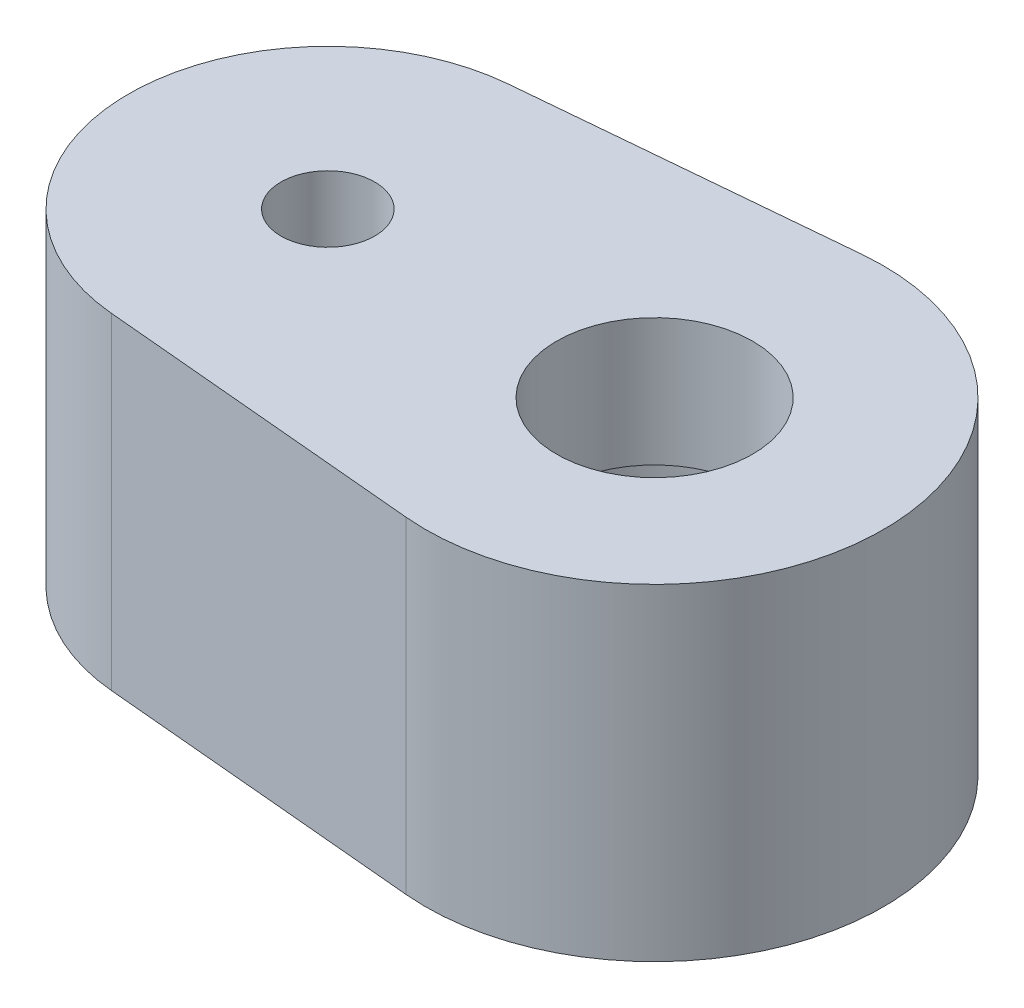
ISO-10303-21;
HEADER;
FILE_DESCRIPTION(('STEP AP214'),'2;1');
FILE_NAME('part.step','',(''),(''),'','','');
FILE_SCHEMA(('AUTOMOTIVE_DESIGN { 1 0 10303 214 1 1 1 1 }'));
ENDSEC;
DATA;
#1=APPLICATION_CONTEXT('core data for automotive mechanical design processes');
#2=APPLICATION_PROTOCOL_DEFINITION('international standard','automotive_design',2000,#1);
#3=PRODUCT_CONTEXT('',#1,'mechanical');
#4=PRODUCT('Part','Part','',(#3));
#5=PRODUCT_RELATED_PRODUCT_CATEGORY('part','',(#4));
#6=PRODUCT_DEFINITION_FORMATION('','',#4);
#7=PRODUCT_DEFINITION_CONTEXT('part definition',#1,'design');
#8=PRODUCT_DEFINITION('design','',#6,#7);
#9=PRODUCT_DEFINITION_SHAPE('','',#8);
#10=(LENGTH_UNIT() NAMED_UNIT(*) SI_UNIT(.MILLI.,.METRE.));
#11=(NAMED_UNIT(*) PLANE_ANGLE_UNIT() SI_UNIT($,.RADIAN.));
#12=(NAMED_UNIT(*) SI_UNIT($,.STERADIAN.) SOLID_ANGLE_UNIT());
#13=UNCERTAINTY_MEASURE_WITH_UNIT(LENGTH_MEASURE(1.E-05),#10,'distance_accuracy_value','');
#14=(GEOMETRIC_REPRESENTATION_CONTEXT(3) GLOBAL_UNCERTAINTY_ASSIGNED_CONTEXT((#13)) GLOBAL_UNIT_ASSIGNED_CONTEXT((#10,
#11,#12)) REPRESENTATION_CONTEXT('',''));
#15=CARTESIAN_POINT('',(0.,0.,0.));
#16=DIRECTION('',(0.,0.,1.));
#17=DIRECTION('',(1.,0.,0.));
#18=AXIS2_PLACEMENT_3D('',#15,#16,#17);
#19=CARTESIAN_POINT('',(-2.,-1.,0.));
#20=DIRECTION('',(0.,1.,0.));
#21=DIRECTION('',(0.,0.,1.));
#22=AXIS2_PLACEMENT_3D('',#19,#20,#21);
#23=CYLINDRICAL_SURFACE('',#22,1.22);
#24=DIRECTION('',(0.,1.,0.));
#25=VECTOR('',#24,1.);
#26=CARTESIAN_POINT('',(-2.1098,-1.,1.21504895374631));
#27=LINE('',#26,#25);
#28=CARTESIAN_POINT('',(-2.1098,-1.,1.21504895374631));
#29=VERTEX_POINT('',#28);
#30=CARTESIAN_POINT('',(-2.1098,1.,1.21504895374631));
#31=VERTEX_POINT('',#30);
#32=EDGE_CURVE('E36',#29,#31,#27,.T.);
#33=ORIENTED_EDGE('',*,*,#32,.T.);
#34=CARTESIAN_POINT('',(-2.,1.,0.));
#35=DIRECTION('',(0.,1.,0.));
#36=DIRECTION('',(0.,0.,1.));
#37=AXIS2_PLACEMENT_3D('',#34,#35,#36);
#38=CIRCLE('',#37,1.22);
#39=CARTESIAN_POINT('',(-2.1098,1.,-1.21504895374631));
#40=VERTEX_POINT('',#39);
#41=EDGE_CURVE('E73',#40,#31,#38,.T.);
#42=ORIENTED_EDGE('',*,*,#41,.F.);
#43=DIRECTION('',(0.,1.,0.));
#44=VECTOR('',#43,1.);
#45=CARTESIAN_POINT('',(-2.1098,-1.,-1.21504895374631));
#46=LINE('',#45,#44);
#47=CARTESIAN_POINT('',(-2.1098,-1.,-1.21504895374631));
#48=VERTEX_POINT('',#47);
#49=EDGE_CURVE('E11',#48,#40,#46,.T.);
#50=ORIENTED_EDGE('',*,*,#49,.F.);
#51=CARTESIAN_POINT('',(-2.,-1.,0.));
#52=DIRECTION('',(0.,1.,0.));
#53=DIRECTION('',(0.,0.,1.));
#54=AXIS2_PLACEMENT_3D('',#51,#52,#53);
#55=CIRCLE('',#54,1.22);
#56=EDGE_CURVE('E74',#48,#29,#55,.T.);
#57=ORIENTED_EDGE('',*,*,#56,.T.);
#58=EDGE_LOOP('',(#33,#42,#50,#57));
#59=FACE_BOUND('',#58,.T.);
#60=ADVANCED_FACE('F33',(#59),#23,.T.);
#61=CARTESIAN_POINT('',(-2.1098,-1.,-1.21504895374631));
#62=DIRECTION('',(-0.0900000000000001,0.,-0.995941765365827));
#63=DIRECTION('',(-0.995941765365827,0.,0.0900000000000001));
#64=AXIS2_PLACEMENT_3D('',#61,#62,#63);
#65=PLANE('',#64);
#66=ORIENTED_EDGE('',*,*,#49,.T.);
#67=DIRECTION('',(-0.995941765365827,0.,0.0900000000000001));
#68=VECTOR('',#67,1.);
#69=CARTESIAN_POINT('',(-2.1098,1.,-1.21504895374631));
#70=LINE('',#69,#68);
#71=CARTESIAN_POINT('',(-0.126,1.,-1.39431847151216));
#72=VERTEX_POINT('',#71);
#73=EDGE_CURVE('E90',#72,#40,#70,.T.);
#74=ORIENTED_EDGE('',*,*,#73,.F.);
#75=DIRECTION('',(0.,1.,0.));
#76=VECTOR('',#75,1.);
#77=CARTESIAN_POINT('',(-0.126,-1.,-1.39431847151216));
#78=LINE('',#77,#76);
#79=CARTESIAN_POINT('',(-0.126,-1.,-1.39431847151216));
#80=VERTEX_POINT('',#79);
#81=EDGE_CURVE('E41',#80,#72,#78,.T.);
#82=ORIENTED_EDGE('',*,*,#81,.F.);
#83=DIRECTION('',(-0.995941765365827,0.,0.0900000000000001));
#84=VECTOR('',#83,1.);
#85=CARTESIAN_POINT('',(-2.1098,-1.,-1.21504895374631));
#86=LINE('',#85,#84);
#87=EDGE_CURVE('E79',#80,#48,#86,.T.);
#88=ORIENTED_EDGE('',*,*,#87,.T.);
#89=EDGE_LOOP('',(#66,#74,#82,#88));
#90=FACE_BOUND('',#89,.T.);
#91=ADVANCED_FACE('F110',(#90),#65,.T.);
#92=CARTESIAN_POINT('',(0.,-1.,0.));
#93=DIRECTION('',(0.,1.,0.));
#94=DIRECTION('',(0.,0.,1.));
#95=AXIS2_PLACEMENT_3D('',#92,#93,#94);
#96=CYLINDRICAL_SURFACE('',#95,1.4);
#97=ORIENTED_EDGE('',*,*,#81,.T.);
#98=CARTESIAN_POINT('',(0.,1.,0.));
#99=DIRECTION('',(0.,1.,0.));
#100=DIRECTION('',(0.,0.,1.));
#101=AXIS2_PLACEMENT_3D('',#98,#99,#100);
#102=CIRCLE('',#101,1.4);
#103=CARTESIAN_POINT('',(-0.126,1.,1.39431847151216));
#104=VERTEX_POINT('',#103);
#105=EDGE_CURVE('E86',#104,#72,#102,.T.);
#106=ORIENTED_EDGE('',*,*,#105,.F.);
#107=DIRECTION('',(0.,1.,0.));
#108=VECTOR('',#107,1.);
#109=CARTESIAN_POINT('',(-0.126,-1.,1.39431847151216));
#110=LINE('',#109,#108);
#111=CARTESIAN_POINT('',(-0.126,-1.,1.39431847151216));
#112=VERTEX_POINT('',#111);
#113=EDGE_CURVE('E78',#112,#104,#110,.T.);
#114=ORIENTED_EDGE('',*,*,#113,.F.);
#115=CARTESIAN_POINT('',(0.,-1.,0.));
#116=DIRECTION('',(0.,1.,0.));
#117=DIRECTION('',(0.,0.,1.));
#118=AXIS2_PLACEMENT_3D('',#115,#116,#117);
#119=CIRCLE('',#118,1.4);
#120=EDGE_CURVE('E103',#112,#80,#119,.T.);
#121=ORIENTED_EDGE('',*,*,#120,.T.);
#122=EDGE_LOOP('',(#97,#106,#114,#121));
#123=FACE_BOUND('',#122,.T.);
#124=ADVANCED_FACE('F107',(#123),#96,.T.);
#125=CARTESIAN_POINT('',(-2.1098,-1.,1.21504895374631));
#126=DIRECTION('',(-0.0899999999999997,0.,0.995941765365827));
#127=DIRECTION('',(0.995941765365827,0.,0.0899999999999997));
#128=AXIS2_PLACEMENT_3D('',#125,#126,#127);
#129=PLANE('',#128);
#130=ORIENTED_EDGE('',*,*,#113,.T.);
#131=DIRECTION('',(0.995941765365827,0.,0.0899999999999997));
#132=VECTOR('',#131,1.);
#133=CARTESIAN_POINT('',(-2.1098,1.,1.21504895374631));
#134=LINE('',#133,#132);
#135=EDGE_CURVE('E81',#31,#104,#134,.T.);
#136=ORIENTED_EDGE('',*,*,#135,.F.);
#137=ORIENTED_EDGE('',*,*,#32,.F.);
#138=DIRECTION('',(0.995941765365827,0.,0.0899999999999997));
#139=VECTOR('',#138,1.);
#140=CARTESIAN_POINT('',(-2.1098,-1.,1.21504895374631));
#141=LINE('',#140,#139);
#142=EDGE_CURVE('E101',#29,#112,#141,.T.);
#143=ORIENTED_EDGE('',*,*,#142,.T.);
#144=EDGE_LOOP('',(#130,#136,#137,#143));
#145=FACE_BOUND('',#144,.T.);
#146=ADVANCED_FACE('F82',(#145),#129,.T.);
#147=CARTESIAN_POINT('',(-2.,-1.,0.));
#148=DIRECTION('',(0.,1.,0.));
#149=DIRECTION('',(0.,0.,1.));
#150=AXIS2_PLACEMENT_3D('',#147,#148,#149);
#151=PLANE('',#150);
#152=CARTESIAN_POINT('',(-2.,-1.,0.));
#153=DIRECTION('',(0.,1.,0.));
#154=DIRECTION('',(0.,0.,1.));
#155=AXIS2_PLACEMENT_3D('',#152,#153,#154);
#156=CIRCLE('',#155,0.28702);
#157=CARTESIAN_POINT('',(-2.,-1.,0.28702));
#158=VERTEX_POINT('',#157);
#159=EDGE_CURVE('E219',#158,#158,#156,.F.);
#160=ORIENTED_EDGE('',*,*,#159,.F.);
#161=EDGE_LOOP('',(#160));
#162=FACE_BOUND('',#161,.T.);
#163=CARTESIAN_POINT('',(0.,-1.,0.));
#164=DIRECTION('',(0.,-1.,0.));
#165=DIRECTION('',(0.,0.,-1.));
#166=AXIS2_PLACEMENT_3D('',#163,#164,#165);
#167=CIRCLE('',#166,0.6);
#168=CARTESIAN_POINT('',(0.,-1.,-0.6));
#169=VERTEX_POINT('',#168);
#170=EDGE_CURVE('E229',#169,#169,#167,.T.);
#171=ORIENTED_EDGE('',*,*,#170,.F.);
#172=EDGE_LOOP('',(#171));
#173=FACE_BOUND('',#172,.T.);
#174=ORIENTED_EDGE('',*,*,#56,.F.);
#175=ORIENTED_EDGE('',*,*,#87,.F.);
#176=ORIENTED_EDGE('',*,*,#120,.F.);
#177=ORIENTED_EDGE('',*,*,#142,.F.);
#178=EDGE_LOOP('',(#174,#175,#176,#177));
#179=FACE_BOUND('',#178,.T.);
#180=ADVANCED_FACE('F112',(#162,#173,#179),#151,.F.);
#181=CARTESIAN_POINT('',(-2.,1.,0.));
#182=DIRECTION('',(0.,1.,0.));
#183=DIRECTION('',(0.,0.,1.));
#184=AXIS2_PLACEMENT_3D('',#181,#182,#183);
#185=PLANE('',#184);
#186=CARTESIAN_POINT('',(-2.,1.,0.));
#187=DIRECTION('',(0.,1.,0.));
#188=DIRECTION('',(0.,0.,1.));
#189=AXIS2_PLACEMENT_3D('',#186,#187,#188);
#190=CIRCLE('',#189,0.28702);
#191=CARTESIAN_POINT('',(-2.,1.,0.28702));
#192=VERTEX_POINT('',#191);
#193=EDGE_CURVE('E217',#192,#192,#190,.T.);
#194=ORIENTED_EDGE('',*,*,#193,.F.);
#195=EDGE_LOOP('',(#194));
#196=FACE_BOUND('',#195,.T.);
#197=CARTESIAN_POINT('',(0.,1.,0.));
#198=DIRECTION('',(0.,-1.,0.));
#199=DIRECTION('',(0.,0.,-1.));
#200=AXIS2_PLACEMENT_3D('',#197,#198,#199);
#201=CIRCLE('',#200,0.6);
#202=CARTESIAN_POINT('',(0.,1.,-0.6));
#203=VERTEX_POINT('',#202);
#204=EDGE_CURVE('E232',#203,#203,#201,.T.);
#205=ORIENTED_EDGE('',*,*,#204,.T.);
#206=EDGE_LOOP('',(#205));
#207=FACE_BOUND('',#206,.T.);
#208=ORIENTED_EDGE('',*,*,#41,.T.);
#209=ORIENTED_EDGE('',*,*,#135,.T.);
#210=ORIENTED_EDGE('',*,*,#105,.T.);
#211=ORIENTED_EDGE('',*,*,#73,.T.);
#212=EDGE_LOOP('',(#208,#209,#210,#211));
#213=FACE_BOUND('',#212,.T.);
#214=ADVANCED_FACE('F89',(#196,#207,#213),#185,.T.);
#215=CARTESIAN_POINT('',(0.,-1.,0.));
#216=DIRECTION('',(0.,-1.,0.));
#217=DIRECTION('',(0.,0.,-1.));
#218=AXIS2_PLACEMENT_3D('',#215,#216,#217);
#219=CYLINDRICAL_SURFACE('',#218,0.85);
#220=CARTESIAN_POINT('',(0.,0.075,0.));
#221=DIRECTION('',(0.,-1.,0.));
#222=DIRECTION('',(0.,0.,-1.));
#223=AXIS2_PLACEMENT_3D('',#220,#221,#222);
#224=CIRCLE('',#223,0.85);
#225=CARTESIAN_POINT('',(0.,0.075,-0.85));
#226=VERTEX_POINT('',#225);
#227=EDGE_CURVE('E91',#226,#226,#224,.T.);
#228=ORIENTED_EDGE('',*,*,#227,.F.);
#229=EDGE_LOOP('',(#228));
#230=FACE_BOUND('',#229,.T.);
#231=CARTESIAN_POINT('',(0.,-0.075,0.));
#232=DIRECTION('',(0.,-1.,0.));
#233=DIRECTION('',(0.,0.,-1.));
#234=AXIS2_PLACEMENT_3D('',#231,#232,#233);
#235=CIRCLE('',#234,0.85);
#236=CARTESIAN_POINT('',(0.,-0.075,-0.85));
#237=VERTEX_POINT('',#236);
#238=EDGE_CURVE('E220',#237,#237,#235,.T.);
#239=ORIENTED_EDGE('',*,*,#238,.T.);
#240=EDGE_LOOP('',(#239));
#241=FACE_BOUND('',#240,.T.);
#242=ADVANCED_FACE('F120',(#230,#241),#219,.F.);
#243=CARTESIAN_POINT('',(0.,0.075,0.));
#244=DIRECTION('',(0.,-1.,0.));
#245=DIRECTION('',(0.,0.,-1.));
#246=AXIS2_PLACEMENT_3D('',#243,#244,#245);
#247=CONICAL_SURFACE('',#246,0.85,1.0471975511966);
#248=CARTESIAN_POINT('',(0.,0.219337567297406,0.));
#249=DIRECTION('',(0.,-1.,0.));
#250=DIRECTION('',(0.,0.,-1.));
#251=AXIS2_PLACEMENT_3D('',#248,#249,#250);
#252=CIRCLE('',#251,0.6);
#253=CARTESIAN_POINT('',(0.,0.219337567297406,-0.6));
#254=VERTEX_POINT('',#253);
#255=EDGE_CURVE('E94',#254,#254,#252,.T.);
#256=ORIENTED_EDGE('',*,*,#255,.F.);
#257=EDGE_LOOP('',(#256));
#258=FACE_BOUND('',#257,.T.);
#259=ORIENTED_EDGE('',*,*,#227,.T.);
#260=EDGE_LOOP('',(#259));
#261=FACE_BOUND('',#260,.T.);
#262=ADVANCED_FACE('F150',(#258,#261),#247,.F.);
#263=CARTESIAN_POINT('',(0.,-1.,0.));
#264=DIRECTION('',(0.,-1.,0.));
#265=DIRECTION('',(0.,0.,-1.));
#266=AXIS2_PLACEMENT_3D('',#263,#264,#265);
#267=CYLINDRICAL_SURFACE('',#266,0.6);
#268=ORIENTED_EDGE('',*,*,#204,.F.);
#269=EDGE_LOOP('',(#268));
#270=FACE_BOUND('',#269,.T.);
#271=ORIENTED_EDGE('',*,*,#255,.T.);
#272=EDGE_LOOP('',(#271));
#273=FACE_BOUND('',#272,.T.);
#274=ADVANCED_FACE('F161',(#270,#273),#267,.F.);
#275=CARTESIAN_POINT('',(0.,-1.,0.));
#276=DIRECTION('',(0.,-1.,0.));
#277=DIRECTION('',(0.,0.,-1.));
#278=AXIS2_PLACEMENT_3D('',#275,#276,#277);
#279=CYLINDRICAL_SURFACE('',#278,0.6);
#280=CARTESIAN_POINT('',(0.,-0.219337567297406,0.));
#281=DIRECTION('',(0.,-1.,0.));
#282=DIRECTION('',(0.,0.,-1.));
#283=AXIS2_PLACEMENT_3D('',#280,#281,#282);
#284=CIRCLE('',#283,0.6);
#285=CARTESIAN_POINT('',(0.,-0.219337567297406,-0.6));
#286=VERTEX_POINT('',#285);
#287=EDGE_CURVE('E223',#286,#286,#284,.T.);
#288=ORIENTED_EDGE('',*,*,#287,.F.);
#289=EDGE_LOOP('',(#288));
#290=FACE_BOUND('',#289,.T.);
#291=ORIENTED_EDGE('',*,*,#170,.T.);
#292=EDGE_LOOP('',(#291));
#293=FACE_BOUND('',#292,.T.);
#294=ADVANCED_FACE('F171',(#290,#293),#279,.F.);
#295=CARTESIAN_POINT('',(0.,-0.219337567297406,0.));
#296=DIRECTION('',(0.,1.,0.));
#297=DIRECTION('',(0.,0.,1.));
#298=AXIS2_PLACEMENT_3D('',#295,#296,#297);
#299=CONICAL_SURFACE('',#298,0.6,1.0471975511966);
#300=ORIENTED_EDGE('',*,*,#238,.F.);
#301=EDGE_LOOP('',(#300));
#302=FACE_BOUND('',#301,.T.);
#303=ORIENTED_EDGE('',*,*,#287,.T.);
#304=EDGE_LOOP('',(#303));
#305=FACE_BOUND('',#304,.T.);
#306=ADVANCED_FACE('F181',(#302,#305),#299,.F.);
#307=CARTESIAN_POINT('',(-2.,-1.001,0.));
#308=DIRECTION('',(0.,1.,0.));
#309=DIRECTION('',(0.,0.,1.));
#310=AXIS2_PLACEMENT_3D('',#307,#308,#309);
#311=CYLINDRICAL_SURFACE('',#310,0.28702);
#312=ORIENTED_EDGE('',*,*,#193,.T.);
#313=EDGE_LOOP('',(#312));
#314=FACE_BOUND('',#313,.T.);
#315=ORIENTED_EDGE('',*,*,#159,.T.);
#316=EDGE_LOOP('',(#315));
#317=FACE_BOUND('',#316,.T.);
#318=ADVANCED_FACE('F190',(#314,#317),#311,.F.);
#319=CLOSED_SHELL('',(#60,#91,#124,#146,#180,#214,#242,#262,#274,#294,#306,#318));
#320=MANIFOLD_SOLID_BREP('B2',#319);
#321=ADVANCED_BREP_SHAPE_REPRESENTATION('',(#18,#320),#14);
#322=SHAPE_DEFINITION_REPRESENTATION(#9,#321);
ENDSEC;
END-ISO-10303-21;
